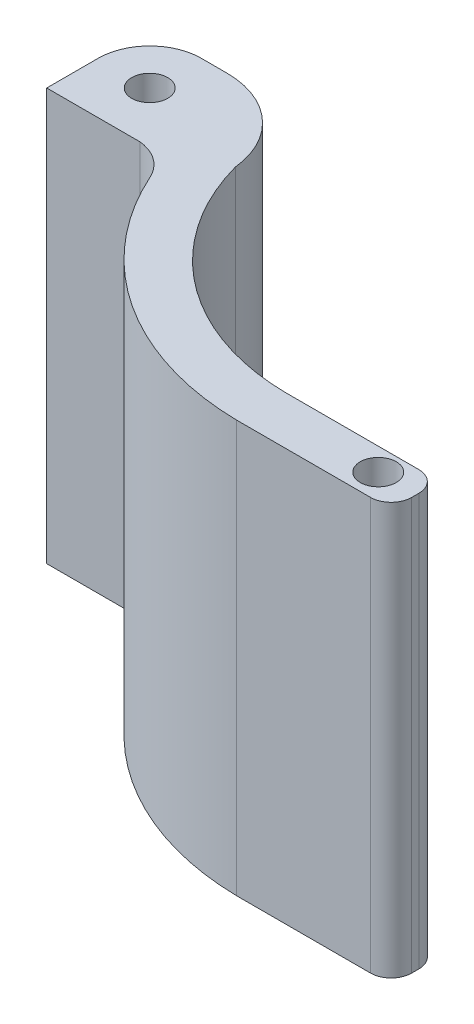
ISO-10303-21;
HEADER;
FILE_DESCRIPTION(('STEP AP214'),'2;1');
FILE_NAME('part.step','',(''),(''),'','','');
FILE_SCHEMA(('AUTOMOTIVE_DESIGN { 1 0 10303 214 1 1 1 1 }'));
ENDSEC;
DATA;
#1=APPLICATION_CONTEXT('core data for automotive mechanical design processes');
#2=APPLICATION_PROTOCOL_DEFINITION('international standard','automotive_design',2000,#1);
#3=PRODUCT_CONTEXT('',#1,'mechanical');
#4=PRODUCT('Part','Part','',(#3));
#5=PRODUCT_RELATED_PRODUCT_CATEGORY('part','',(#4));
#6=PRODUCT_DEFINITION_FORMATION('','',#4);
#7=PRODUCT_DEFINITION_CONTEXT('part definition',#1,'design');
#8=PRODUCT_DEFINITION('design','',#6,#7);
#9=PRODUCT_DEFINITION_SHAPE('','',#8);
#10=(LENGTH_UNIT() NAMED_UNIT(*) SI_UNIT(.MILLI.,.METRE.));
#11=(NAMED_UNIT(*) PLANE_ANGLE_UNIT() SI_UNIT($,.RADIAN.));
#12=(NAMED_UNIT(*) SI_UNIT($,.STERADIAN.) SOLID_ANGLE_UNIT());
#13=UNCERTAINTY_MEASURE_WITH_UNIT(LENGTH_MEASURE(1.E-05),#10,'distance_accuracy_value','');
#14=(GEOMETRIC_REPRESENTATION_CONTEXT(3) GLOBAL_UNCERTAINTY_ASSIGNED_CONTEXT((#13)) GLOBAL_UNIT_ASSIGNED_CONTEXT((#10,
#11,#12)) REPRESENTATION_CONTEXT('',''));
#15=CARTESIAN_POINT('',(0.,0.,0.));
#16=DIRECTION('',(0.,0.,1.));
#17=DIRECTION('',(1.,0.,0.));
#18=AXIS2_PLACEMENT_3D('',#15,#16,#17);
#19=CARTESIAN_POINT('',(-94.3917954966248,40.,-29.5011380138342));
#20=DIRECTION('',(0.,-1.,0.));
#21=DIRECTION('',(0.,0.,-1.));
#22=AXIS2_PLACEMENT_3D('',#19,#20,#21);
#23=PLANE('',#22);
#24=CARTESIAN_POINT('',(-94.3917954966248,40.,-29.5011380138342));
#25=DIRECTION('',(0.,1.,0.));
#26=DIRECTION('',(0.,0.,-1.));
#27=AXIS2_PLACEMENT_3D('',#24,#25,#26);
#28=CIRCLE('',#27,8.3508565841173);
#29=CARTESIAN_POINT('',(-86.0843982651353,40.,-30.3519945979515));
#30=VERTEX_POINT('',#29);
#31=CARTESIAN_POINT('',(-94.3917954966248,40.,-37.8519945979515));
#32=VERTEX_POINT('',#31);
#33=EDGE_CURVE('E185',#30,#32,#28,.T.);
#34=ORIENTED_EDGE('',*,*,#33,.T.);
#35=DIRECTION('',(-1.,0.,0.));
#36=VECTOR('',#35,1.);
#37=CARTESIAN_POINT('',(-96.8917954966248,40.,-37.8519945979515));
#38=LINE('',#37,#36);
#39=CARTESIAN_POINT('',(-96.8917954966248,40.,-37.8519945979515));
#40=VERTEX_POINT('',#39);
#41=EDGE_CURVE('E108',#32,#40,#38,.T.);
#42=ORIENTED_EDGE('',*,*,#41,.T.);
#43=CARTESIAN_POINT('',(-96.8917954966248,40.,-32.8519945979515));
#44=DIRECTION('',(0.,1.,0.));
#45=DIRECTION('',(0.,0.,-1.));
#46=AXIS2_PLACEMENT_3D('',#43,#44,#45);
#47=CIRCLE('',#46,4.99999999999999);
#48=CARTESIAN_POINT('',(-101.891795496625,40.,-32.8519945979515));
#49=VERTEX_POINT('',#48);
#50=EDGE_CURVE('E215',#40,#49,#47,.T.);
#51=ORIENTED_EDGE('',*,*,#50,.T.);
#52=DIRECTION('',(0.,0.,1.));
#53=VECTOR('',#52,1.);
#54=CARTESIAN_POINT('',(-101.891795496625,40.,-32.8519945979515));
#55=LINE('',#54,#53);
#56=CARTESIAN_POINT('',(-101.891795496625,40.,-27.8519945979515));
#57=VERTEX_POINT('',#56);
#58=EDGE_CURVE('E234',#49,#57,#55,.T.);
#59=ORIENTED_EDGE('',*,*,#58,.T.);
#60=DIRECTION('',(1.,0.,0.));
#61=VECTOR('',#60,1.);
#62=CARTESIAN_POINT('',(-92.8473054087636,40.,-27.8519945979515));
#63=LINE('',#62,#61);
#64=CARTESIAN_POINT('',(-92.8473054087636,40.,-27.8519945979515));
#65=VERTEX_POINT('',#64);
#66=EDGE_CURVE('E231',#57,#65,#63,.T.);
#67=ORIENTED_EDGE('',*,*,#66,.T.);
#68=CARTESIAN_POINT('',(-93.264374858203,40.,-23.5966883254714));
#69=DIRECTION('',(0.,-1.,0.));
#70=DIRECTION('',(0.,0.,1.));
#71=AXIS2_PLACEMENT_3D('',#68,#69,#70);
#72=CIRCLE('',#71,4.27569624719349);
#73=CARTESIAN_POINT('',(-89.3655957816127,40.,-25.3519945979515));
#74=VERTEX_POINT('',#73);
#75=EDGE_CURVE('E233',#65,#74,#72,.T.);
#76=ORIENTED_EDGE('',*,*,#75,.T.);
#77=CARTESIAN_POINT('',(-64.2898143397932,40.,-36.6415997762619));
#78=DIRECTION('',(0.,1.,0.));
#79=DIRECTION('',(0.,0.,1.));
#80=AXIS2_PLACEMENT_3D('',#77,#78,#79);
#81=CIRCLE('',#80,27.5000000000006);
#82=CARTESIAN_POINT('',(-64.7447597290198,40.,-9.14536322118333));
#83=VERTEX_POINT('',#82);
#84=EDGE_CURVE('E236',#74,#83,#81,.T.);
#85=ORIENTED_EDGE('',*,*,#84,.T.);
#86=DIRECTION('',(1.,0.,0.));
#87=VECTOR('',#86,1.);
#88=CARTESIAN_POINT('',(-64.7447597290198,40.,-9.14536322118333));
#89=LINE('',#88,#87);
#90=CARTESIAN_POINT('',(-51.7447597290198,40.,-9.14536322118287));
#91=VERTEX_POINT('',#90);
#92=EDGE_CURVE('E242',#83,#91,#89,.T.);
#93=ORIENTED_EDGE('',*,*,#92,.T.);
#94=CARTESIAN_POINT('',(-51.7447597290198,40.,-11.1453632211829));
#95=DIRECTION('',(0.,1.,0.));
#96=DIRECTION('',(0.,0.,-1.));
#97=AXIS2_PLACEMENT_3D('',#94,#95,#96);
#98=CIRCLE('',#97,2.);
#99=CARTESIAN_POINT('',(-49.7447597290198,40.,-11.1453632211829));
#100=VERTEX_POINT('',#99);
#101=EDGE_CURVE('E244',#91,#100,#98,.T.);
#102=ORIENTED_EDGE('',*,*,#101,.T.);
#103=DIRECTION('',(0.,0.,-1.));
#104=VECTOR('',#103,1.);
#105=CARTESIAN_POINT('',(-49.7447597290198,40.,-11.8316446574437));
#106=LINE('',#105,#104);
#107=CARTESIAN_POINT('',(-49.7447597290198,40.,-11.8316446574437));
#108=VERTEX_POINT('',#107);
#109=EDGE_CURVE('E142',#100,#108,#106,.T.);
#110=ORIENTED_EDGE('',*,*,#109,.T.);
#111=CARTESIAN_POINT('',(-51.7447597290198,40.,-11.8316446574437));
#112=DIRECTION('',(0.,1.,0.));
#113=DIRECTION('',(0.,0.,1.));
#114=AXIS2_PLACEMENT_3D('',#111,#112,#113);
#115=CIRCLE('',#114,2.);
#116=CARTESIAN_POINT('',(-51.7447597290198,40.,-13.8316446574437));
#117=VERTEX_POINT('',#116);
#118=EDGE_CURVE('E136',#108,#117,#115,.T.);
#119=ORIENTED_EDGE('',*,*,#118,.T.);
#120=DIRECTION('',(-1.,0.,0.));
#121=VECTOR('',#120,1.);
#122=CARTESIAN_POINT('',(-64.7460429177072,40.,-13.8316446574437));
#123=LINE('',#122,#121);
#124=CARTESIAN_POINT('',(-64.7460429177072,40.,-13.8316446574437));
#125=VERTEX_POINT('',#124);
#126=EDGE_CURVE('E140',#117,#125,#123,.T.);
#127=ORIENTED_EDGE('',*,*,#126,.T.);
#128=CARTESIAN_POINT('',(-64.3927651310505,40.,-36.3288710377213));
#129=DIRECTION('',(0.,-1.,0.));
#130=DIRECTION('',(0.,0.,1.));
#131=AXIS2_PLACEMENT_3D('',#128,#129,#130);
#132=CIRCLE('',#131,22.5);
#133=EDGE_CURVE('E50',#125,#30,#132,.T.);
#134=ORIENTED_EDGE('',*,*,#133,.T.);
#135=EDGE_LOOP('',(#34,#42,#51,#59,#67,#76,#85,#93,#102,#110,#119,#127,#134));
#136=FACE_BOUND('',#135,.T.);
#137=CARTESIAN_POINT('',(-96.8917954966248,40.,-32.8519945979515));
#138=DIRECTION('',(0.,1.,0.));
#139=DIRECTION('',(0.,0.,1.));
#140=AXIS2_PLACEMENT_3D('',#137,#138,#139);
#141=CIRCLE('',#140,1.75);
#142=CARTESIAN_POINT('',(-96.8917954966248,40.,-31.1019945979515));
#143=VERTEX_POINT('',#142);
#144=EDGE_CURVE('E164',#143,#143,#141,.T.);
#145=ORIENTED_EDGE('',*,*,#144,.F.);
#146=EDGE_LOOP('',(#145));
#147=FACE_BOUND('',#146,.T.);
#148=CARTESIAN_POINT('',(-53.4947597290198,40.,-11.6453632211829));
#149=DIRECTION('',(0.,1.,0.));
#150=DIRECTION('',(0.,0.,1.));
#151=AXIS2_PLACEMENT_3D('',#148,#149,#150);
#152=CIRCLE('',#151,1.75000000001735);
#153=CARTESIAN_POINT('',(-53.4947597290198,40.,-9.89536322116553));
#154=VERTEX_POINT('',#153);
#155=EDGE_CURVE('E285',#154,#154,#152,.T.);
#156=ORIENTED_EDGE('',*,*,#155,.F.);
#157=EDGE_LOOP('',(#156));
#158=FACE_BOUND('',#157,.T.);
#159=ADVANCED_FACE('F33',(#136,#147,#158),#23,.F.);
#160=CARTESIAN_POINT('',(-94.3917954966248,0.,-29.5011380138342));
#161=DIRECTION('',(0.,-1.,0.));
#162=DIRECTION('',(0.,0.,-1.));
#163=AXIS2_PLACEMENT_3D('',#160,#161,#162);
#164=PLANE('',#163);
#165=CARTESIAN_POINT('',(-96.8917954966248,0.,-32.8519945979515));
#166=DIRECTION('',(0.,1.,0.));
#167=DIRECTION('',(0.,0.,1.));
#168=AXIS2_PLACEMENT_3D('',#165,#166,#167);
#169=CIRCLE('',#168,1.75);
#170=CARTESIAN_POINT('',(-96.8917954966248,0.,-31.1019945979515));
#171=VERTEX_POINT('',#170);
#172=EDGE_CURVE('E290',#171,#171,#169,.T.);
#173=ORIENTED_EDGE('',*,*,#172,.T.);
#174=EDGE_LOOP('',(#173));
#175=FACE_BOUND('',#174,.T.);
#176=CARTESIAN_POINT('',(-94.3917954966248,0.,-29.5011380138342));
#177=DIRECTION('',(0.,1.,0.));
#178=DIRECTION('',(0.,0.,-1.));
#179=AXIS2_PLACEMENT_3D('',#176,#177,#178);
#180=CIRCLE('',#179,8.3508565841173);
#181=CARTESIAN_POINT('',(-86.0843982651353,0.,-30.3519945979515));
#182=VERTEX_POINT('',#181);
#183=CARTESIAN_POINT('',(-94.3917954966248,0.,-37.8519945979515));
#184=VERTEX_POINT('',#183);
#185=EDGE_CURVE('E160',#182,#184,#180,.T.);
#186=ORIENTED_EDGE('',*,*,#185,.F.);
#187=CARTESIAN_POINT('',(-64.3927651310505,0.,-36.3288710377213));
#188=DIRECTION('',(0.,-1.,0.));
#189=DIRECTION('',(0.,0.,1.));
#190=AXIS2_PLACEMENT_3D('',#187,#188,#189);
#191=CIRCLE('',#190,22.5);
#192=CARTESIAN_POINT('',(-64.7460429177072,0.,-13.8316446574437));
#193=VERTEX_POINT('',#192);
#194=EDGE_CURVE('E100',#193,#182,#191,.T.);
#195=ORIENTED_EDGE('',*,*,#194,.F.);
#196=DIRECTION('',(-1.,0.,0.));
#197=VECTOR('',#196,1.);
#198=CARTESIAN_POINT('',(-64.7460429177072,0.,-13.8316446574437));
#199=LINE('',#198,#197);
#200=CARTESIAN_POINT('',(-51.7447597290198,0.,-13.8316446574437));
#201=VERTEX_POINT('',#200);
#202=EDGE_CURVE('E94',#201,#193,#199,.T.);
#203=ORIENTED_EDGE('',*,*,#202,.F.);
#204=CARTESIAN_POINT('',(-51.7447597290198,0.,-11.8316446574437));
#205=DIRECTION('',(0.,1.,0.));
#206=DIRECTION('',(0.,0.,1.));
#207=AXIS2_PLACEMENT_3D('',#204,#205,#206);
#208=CIRCLE('',#207,2.);
#209=CARTESIAN_POINT('',(-49.7447597290198,0.,-11.8316446574437));
#210=VERTEX_POINT('',#209);
#211=EDGE_CURVE('E150',#210,#201,#208,.T.);
#212=ORIENTED_EDGE('',*,*,#211,.F.);
#213=DIRECTION('',(0.,0.,-1.));
#214=VECTOR('',#213,1.);
#215=CARTESIAN_POINT('',(-49.7447597290198,0.,-11.8316446574437));
#216=LINE('',#215,#214);
#217=CARTESIAN_POINT('',(-49.7447597290198,0.,-11.1453632211829));
#218=VERTEX_POINT('',#217);
#219=EDGE_CURVE('E180',#218,#210,#216,.T.);
#220=ORIENTED_EDGE('',*,*,#219,.F.);
#221=CARTESIAN_POINT('',(-51.7447597290198,0.,-11.1453632211829));
#222=DIRECTION('',(0.,1.,0.));
#223=DIRECTION('',(0.,0.,-1.));
#224=AXIS2_PLACEMENT_3D('',#221,#222,#223);
#225=CIRCLE('',#224,2.);
#226=CARTESIAN_POINT('',(-51.7447597290198,0.,-9.14536322118287));
#227=VERTEX_POINT('',#226);
#228=EDGE_CURVE('E178',#227,#218,#225,.T.);
#229=ORIENTED_EDGE('',*,*,#228,.F.);
#230=DIRECTION('',(1.,0.,0.));
#231=VECTOR('',#230,1.);
#232=CARTESIAN_POINT('',(-64.7447597290198,0.,-9.14536322118333));
#233=LINE('',#232,#231);
#234=CARTESIAN_POINT('',(-64.7447597290198,0.,-9.14536322118333));
#235=VERTEX_POINT('',#234);
#236=EDGE_CURVE('E176',#235,#227,#233,.T.);
#237=ORIENTED_EDGE('',*,*,#236,.F.);
#238=CARTESIAN_POINT('',(-64.2898143397932,0.,-36.6415997762619));
#239=DIRECTION('',(0.,1.,0.));
#240=DIRECTION('',(0.,0.,1.));
#241=AXIS2_PLACEMENT_3D('',#238,#239,#240);
#242=CIRCLE('',#241,27.5000000000006);
#243=CARTESIAN_POINT('',(-89.3655957816127,0.,-25.3519945979515));
#244=VERTEX_POINT('',#243);
#245=EDGE_CURVE('E174',#244,#235,#242,.T.);
#246=ORIENTED_EDGE('',*,*,#245,.F.);
#247=CARTESIAN_POINT('',(-93.264374858203,0.,-23.5966883254714));
#248=DIRECTION('',(0.,-1.,0.));
#249=DIRECTION('',(0.,0.,1.));
#250=AXIS2_PLACEMENT_3D('',#247,#248,#249);
#251=CIRCLE('',#250,4.27569624719349);
#252=CARTESIAN_POINT('',(-92.8473054087636,0.,-27.8519945979515));
#253=VERTEX_POINT('',#252);
#254=EDGE_CURVE('E172',#253,#244,#251,.T.);
#255=ORIENTED_EDGE('',*,*,#254,.F.);
#256=DIRECTION('',(1.,0.,0.));
#257=VECTOR('',#256,1.);
#258=CARTESIAN_POINT('',(-92.8473054087636,0.,-27.8519945979515));
#259=LINE('',#258,#257);
#260=CARTESIAN_POINT('',(-101.891795496625,0.,-27.8519945979515));
#261=VERTEX_POINT('',#260);
#262=EDGE_CURVE('E170',#261,#253,#259,.T.);
#263=ORIENTED_EDGE('',*,*,#262,.F.);
#264=DIRECTION('',(0.,0.,1.));
#265=VECTOR('',#264,1.);
#266=CARTESIAN_POINT('',(-101.891795496625,0.,-32.8519945979515));
#267=LINE('',#266,#265);
#268=CARTESIAN_POINT('',(-101.891795496625,0.,-32.8519945979515));
#269=VERTEX_POINT('',#268);
#270=EDGE_CURVE('E168',#269,#261,#267,.T.);
#271=ORIENTED_EDGE('',*,*,#270,.F.);
#272=CARTESIAN_POINT('',(-96.8917954966248,0.,-32.8519945979515));
#273=DIRECTION('',(0.,1.,0.));
#274=DIRECTION('',(0.,0.,-1.));
#275=AXIS2_PLACEMENT_3D('',#272,#273,#274);
#276=CIRCLE('',#275,4.99999999999999);
#277=CARTESIAN_POINT('',(-96.8917954966248,0.,-37.8519945979515));
#278=VERTEX_POINT('',#277);
#279=EDGE_CURVE('E166',#278,#269,#276,.T.);
#280=ORIENTED_EDGE('',*,*,#279,.F.);
#281=DIRECTION('',(-1.,0.,0.));
#282=VECTOR('',#281,1.);
#283=CARTESIAN_POINT('',(-96.8917954966248,0.,-37.8519945979515));
#284=LINE('',#283,#282);
#285=EDGE_CURVE('E163',#184,#278,#284,.T.);
#286=ORIENTED_EDGE('',*,*,#285,.F.);
#287=EDGE_LOOP('',(#186,#195,#203,#212,#220,#229,#237,#246,#255,#263,#271,#280,#286));
#288=FACE_BOUND('',#287,.T.);
#289=CARTESIAN_POINT('',(-53.4947597290198,0.,-11.6453632211829));
#290=DIRECTION('',(0.,1.,0.));
#291=DIRECTION('',(0.,0.,1.));
#292=AXIS2_PLACEMENT_3D('',#289,#290,#291);
#293=CIRCLE('',#292,1.75000000001735);
#294=CARTESIAN_POINT('',(-53.4947597290198,0.,-9.89536322116553));
#295=VERTEX_POINT('',#294);
#296=EDGE_CURVE('E288',#295,#295,#293,.T.);
#297=ORIENTED_EDGE('',*,*,#296,.T.);
#298=EDGE_LOOP('',(#297));
#299=FACE_BOUND('',#298,.T.);
#300=ADVANCED_FACE('F219',(#175,#288,#299),#164,.T.);
#301=CARTESIAN_POINT('',(-94.3917954966248,40.,-29.5011380138342));
#302=DIRECTION('',(0.,-1.,0.));
#303=DIRECTION('',(0.,0.,-1.));
#304=AXIS2_PLACEMENT_3D('',#301,#302,#303);
#305=CYLINDRICAL_SURFACE('',#304,8.3508565841173);
#306=ORIENTED_EDGE('',*,*,#185,.T.);
#307=DIRECTION('',(0.,-1.,0.));
#308=VECTOR('',#307,1.);
#309=CARTESIAN_POINT('',(-94.3917954966248,40.,-37.8519945979515));
#310=LINE('',#309,#308);
#311=EDGE_CURVE('E11',#32,#184,#310,.T.);
#312=ORIENTED_EDGE('',*,*,#311,.F.);
#313=ORIENTED_EDGE('',*,*,#33,.F.);
#314=DIRECTION('',(0.,-1.,0.));
#315=VECTOR('',#314,1.);
#316=CARTESIAN_POINT('',(-86.0843982651353,40.,-30.3519945979515));
#317=LINE('',#316,#315);
#318=EDGE_CURVE('E156',#30,#182,#317,.T.);
#319=ORIENTED_EDGE('',*,*,#318,.T.);
#320=EDGE_LOOP('',(#306,#312,#313,#319));
#321=FACE_BOUND('',#320,.T.);
#322=ADVANCED_FACE('F35',(#321),#305,.T.);
#323=CARTESIAN_POINT('',(-96.8917954966248,40.,-37.8519945979515));
#324=DIRECTION('',(0.,0.,1.));
#325=DIRECTION('',(1.,0.,0.));
#326=AXIS2_PLACEMENT_3D('',#323,#324,#325);
#327=PLANE('',#326);
#328=ORIENTED_EDGE('',*,*,#285,.T.);
#329=DIRECTION('',(0.,-1.,0.));
#330=VECTOR('',#329,1.);
#331=CARTESIAN_POINT('',(-96.8917954966248,40.,-37.8519945979515));
#332=LINE('',#331,#330);
#333=EDGE_CURVE('E42',#40,#278,#332,.T.);
#334=ORIENTED_EDGE('',*,*,#333,.F.);
#335=ORIENTED_EDGE('',*,*,#41,.F.);
#336=ORIENTED_EDGE('',*,*,#311,.T.);
#337=EDGE_LOOP('',(#328,#334,#335,#336));
#338=FACE_BOUND('',#337,.T.);
#339=ADVANCED_FACE('F395',(#338),#327,.F.);
#340=CARTESIAN_POINT('',(-96.8917954966248,40.,-32.8519945979515));
#341=DIRECTION('',(0.,-1.,0.));
#342=DIRECTION('',(0.,0.,-1.));
#343=AXIS2_PLACEMENT_3D('',#340,#341,#342);
#344=CYLINDRICAL_SURFACE('',#343,4.99999999999999);
#345=ORIENTED_EDGE('',*,*,#279,.T.);
#346=DIRECTION('',(0.,-1.,0.));
#347=VECTOR('',#346,1.);
#348=CARTESIAN_POINT('',(-101.891795496625,40.,-32.8519945979515));
#349=LINE('',#348,#347);
#350=EDGE_CURVE('E207',#49,#269,#349,.T.);
#351=ORIENTED_EDGE('',*,*,#350,.F.);
#352=ORIENTED_EDGE('',*,*,#50,.F.);
#353=ORIENTED_EDGE('',*,*,#333,.T.);
#354=EDGE_LOOP('',(#345,#351,#352,#353));
#355=FACE_BOUND('',#354,.T.);
#356=ADVANCED_FACE('F213',(#355),#344,.T.);
#357=CARTESIAN_POINT('',(-101.891795496625,40.,-32.8519945979515));
#358=DIRECTION('',(1.,0.,0.));
#359=DIRECTION('',(0.,0.,-1.));
#360=AXIS2_PLACEMENT_3D('',#357,#358,#359);
#361=PLANE('',#360);
#362=ORIENTED_EDGE('',*,*,#270,.T.);
#363=DIRECTION('',(0.,-1.,0.));
#364=VECTOR('',#363,1.);
#365=CARTESIAN_POINT('',(-101.891795496625,40.,-27.8519945979515));
#366=LINE('',#365,#364);
#367=EDGE_CURVE('E204',#57,#261,#366,.T.);
#368=ORIENTED_EDGE('',*,*,#367,.F.);
#369=ORIENTED_EDGE('',*,*,#58,.F.);
#370=ORIENTED_EDGE('',*,*,#350,.T.);
#371=EDGE_LOOP('',(#362,#368,#369,#370));
#372=FACE_BOUND('',#371,.T.);
#373=ADVANCED_FACE('F225',(#372),#361,.F.);
#374=CARTESIAN_POINT('',(-92.8473054087636,40.,-27.8519945979515));
#375=DIRECTION('',(0.,0.,-1.));
#376=DIRECTION('',(-1.,0.,0.));
#377=AXIS2_PLACEMENT_3D('',#374,#375,#376);
#378=PLANE('',#377);
#379=ORIENTED_EDGE('',*,*,#262,.T.);
#380=DIRECTION('',(0.,-1.,0.));
#381=VECTOR('',#380,1.);
#382=CARTESIAN_POINT('',(-92.8473054087636,40.,-27.8519945979515));
#383=LINE('',#382,#381);
#384=EDGE_CURVE('E201',#65,#253,#383,.T.);
#385=ORIENTED_EDGE('',*,*,#384,.F.);
#386=ORIENTED_EDGE('',*,*,#66,.F.);
#387=ORIENTED_EDGE('',*,*,#367,.T.);
#388=EDGE_LOOP('',(#379,#385,#386,#387));
#389=FACE_BOUND('',#388,.T.);
#390=ADVANCED_FACE('F229',(#389),#378,.F.);
#391=CARTESIAN_POINT('',(-93.264374858203,40.,-23.5966883254714));
#392=DIRECTION('',(0.,-1.,0.));
#393=DIRECTION('',(0.,0.,-1.));
#394=AXIS2_PLACEMENT_3D('',#391,#392,#393);
#395=CYLINDRICAL_SURFACE('',#394,4.27569624719349);
#396=ORIENTED_EDGE('',*,*,#254,.T.);
#397=DIRECTION('',(0.,-1.,0.));
#398=VECTOR('',#397,1.);
#399=CARTESIAN_POINT('',(-89.3655957816127,40.,-25.3519945979515));
#400=LINE('',#399,#398);
#401=EDGE_CURVE('E198',#74,#244,#400,.T.);
#402=ORIENTED_EDGE('',*,*,#401,.F.);
#403=ORIENTED_EDGE('',*,*,#75,.F.);
#404=ORIENTED_EDGE('',*,*,#384,.T.);
#405=EDGE_LOOP('',(#396,#402,#403,#404));
#406=FACE_BOUND('',#405,.T.);
#407=ADVANCED_FACE('F360',(#406),#395,.F.);
#408=CARTESIAN_POINT('',(-64.2898143397932,40.,-36.6415997762619));
#409=DIRECTION('',(0.,-1.,0.));
#410=DIRECTION('',(0.,0.,-1.));
#411=AXIS2_PLACEMENT_3D('',#408,#409,#410);
#412=CYLINDRICAL_SURFACE('',#411,27.5000000000006);
#413=ORIENTED_EDGE('',*,*,#245,.T.);
#414=DIRECTION('',(0.,-1.,0.));
#415=VECTOR('',#414,1.);
#416=CARTESIAN_POINT('',(-64.7447597290198,40.,-9.14536322118333));
#417=LINE('',#416,#415);
#418=EDGE_CURVE('E195',#83,#235,#417,.T.);
#419=ORIENTED_EDGE('',*,*,#418,.F.);
#420=ORIENTED_EDGE('',*,*,#84,.F.);
#421=ORIENTED_EDGE('',*,*,#401,.T.);
#422=EDGE_LOOP('',(#413,#419,#420,#421));
#423=FACE_BOUND('',#422,.T.);
#424=ADVANCED_FACE('F350',(#423),#412,.T.);
#425=CARTESIAN_POINT('',(-64.7447597290198,40.,-9.14536322118333));
#426=DIRECTION('',(0.,0.,-1.));
#427=DIRECTION('',(-1.,0.,0.));
#428=AXIS2_PLACEMENT_3D('',#425,#426,#427);
#429=PLANE('',#428);
#430=ORIENTED_EDGE('',*,*,#236,.T.);
#431=DIRECTION('',(0.,-1.,0.));
#432=VECTOR('',#431,1.);
#433=CARTESIAN_POINT('',(-51.7447597290198,40.,-9.14536322118287));
#434=LINE('',#433,#432);
#435=EDGE_CURVE('E192',#91,#227,#434,.T.);
#436=ORIENTED_EDGE('',*,*,#435,.F.);
#437=ORIENTED_EDGE('',*,*,#92,.F.);
#438=ORIENTED_EDGE('',*,*,#418,.T.);
#439=EDGE_LOOP('',(#430,#436,#437,#438));
#440=FACE_BOUND('',#439,.T.);
#441=ADVANCED_FACE('F341',(#440),#429,.F.);
#442=CARTESIAN_POINT('',(-51.7447597290198,40.,-11.1453632211829));
#443=DIRECTION('',(0.,-1.,0.));
#444=DIRECTION('',(0.,0.,-1.));
#445=AXIS2_PLACEMENT_3D('',#442,#443,#444);
#446=CYLINDRICAL_SURFACE('',#445,2.);
#447=ORIENTED_EDGE('',*,*,#228,.T.);
#448=DIRECTION('',(0.,-1.,0.));
#449=VECTOR('',#448,1.);
#450=CARTESIAN_POINT('',(-49.7447597290198,40.,-11.1453632211829));
#451=LINE('',#450,#449);
#452=EDGE_CURVE('E189',#100,#218,#451,.T.);
#453=ORIENTED_EDGE('',*,*,#452,.F.);
#454=ORIENTED_EDGE('',*,*,#101,.F.);
#455=ORIENTED_EDGE('',*,*,#435,.T.);
#456=EDGE_LOOP('',(#447,#453,#454,#455));
#457=FACE_BOUND('',#456,.T.);
#458=ADVANCED_FACE('F250',(#457),#446,.T.);
#459=CARTESIAN_POINT('',(-49.7447597290198,40.,-11.8316446574437));
#460=DIRECTION('',(-1.,0.,0.));
#461=DIRECTION('',(0.,0.,1.));
#462=AXIS2_PLACEMENT_3D('',#459,#460,#461);
#463=PLANE('',#462);
#464=ORIENTED_EDGE('',*,*,#219,.T.);
#465=DIRECTION('',(0.,-1.,0.));
#466=VECTOR('',#465,1.);
#467=CARTESIAN_POINT('',(-49.7447597290198,40.,-11.8316446574437));
#468=LINE('',#467,#466);
#469=EDGE_CURVE('E151',#108,#210,#468,.T.);
#470=ORIENTED_EDGE('',*,*,#469,.F.);
#471=ORIENTED_EDGE('',*,*,#109,.F.);
#472=ORIENTED_EDGE('',*,*,#452,.T.);
#473=EDGE_LOOP('',(#464,#470,#471,#472));
#474=FACE_BOUND('',#473,.T.);
#475=ADVANCED_FACE('F254',(#474),#463,.F.);
#476=CARTESIAN_POINT('',(-51.7447597290198,40.,-11.8316446574437));
#477=DIRECTION('',(0.,-1.,0.));
#478=DIRECTION('',(0.,0.,-1.));
#479=AXIS2_PLACEMENT_3D('',#476,#477,#478);
#480=CYLINDRICAL_SURFACE('',#479,2.);
#481=ORIENTED_EDGE('',*,*,#211,.T.);
#482=DIRECTION('',(0.,-1.,0.));
#483=VECTOR('',#482,1.);
#484=CARTESIAN_POINT('',(-51.7447597290198,40.,-13.8316446574437));
#485=LINE('',#484,#483);
#486=EDGE_CURVE('E147',#117,#201,#485,.T.);
#487=ORIENTED_EDGE('',*,*,#486,.F.);
#488=ORIENTED_EDGE('',*,*,#118,.F.);
#489=ORIENTED_EDGE('',*,*,#469,.T.);
#490=EDGE_LOOP('',(#481,#487,#488,#489));
#491=FACE_BOUND('',#490,.T.);
#492=ADVANCED_FACE('F148',(#491),#480,.T.);
#493=CARTESIAN_POINT('',(-64.7460429177072,40.,-13.8316446574437));
#494=DIRECTION('',(0.,0.,1.));
#495=DIRECTION('',(1.,0.,0.));
#496=AXIS2_PLACEMENT_3D('',#493,#494,#495);
#497=PLANE('',#496);
#498=ORIENTED_EDGE('',*,*,#202,.T.);
#499=DIRECTION('',(0.,-1.,0.));
#500=VECTOR('',#499,1.);
#501=CARTESIAN_POINT('',(-64.7460429177072,40.,-13.8316446574437));
#502=LINE('',#501,#500);
#503=EDGE_CURVE('E152',#125,#193,#502,.T.);
#504=ORIENTED_EDGE('',*,*,#503,.F.);
#505=ORIENTED_EDGE('',*,*,#126,.F.);
#506=ORIENTED_EDGE('',*,*,#486,.T.);
#507=EDGE_LOOP('',(#498,#504,#505,#506));
#508=FACE_BOUND('',#507,.T.);
#509=ADVANCED_FACE('F154',(#508),#497,.F.);
#510=CARTESIAN_POINT('',(-64.3927651310505,40.,-36.3288710377213));
#511=DIRECTION('',(0.,-1.,0.));
#512=DIRECTION('',(0.,0.,-1.));
#513=AXIS2_PLACEMENT_3D('',#510,#511,#512);
#514=CYLINDRICAL_SURFACE('',#513,22.5);
#515=ORIENTED_EDGE('',*,*,#194,.T.);
#516=ORIENTED_EDGE('',*,*,#318,.F.);
#517=ORIENTED_EDGE('',*,*,#133,.F.);
#518=ORIENTED_EDGE('',*,*,#503,.T.);
#519=EDGE_LOOP('',(#515,#516,#517,#518));
#520=FACE_BOUND('',#519,.T.);
#521=ADVANCED_FACE('F258',(#520),#514,.F.);
#522=CARTESIAN_POINT('',(-96.8917954966248,40.,-32.8519945979515));
#523=DIRECTION('',(0.,-1.,0.));
#524=DIRECTION('',(0.,0.,-1.));
#525=AXIS2_PLACEMENT_3D('',#522,#523,#524);
#526=CYLINDRICAL_SURFACE('',#525,1.75);
#527=ORIENTED_EDGE('',*,*,#144,.T.);
#528=EDGE_LOOP('',(#527));
#529=FACE_BOUND('',#528,.T.);
#530=ORIENTED_EDGE('',*,*,#172,.F.);
#531=EDGE_LOOP('',(#530));
#532=FACE_BOUND('',#531,.T.);
#533=ADVANCED_FACE('F260',(#529,#532),#526,.F.);
#534=CARTESIAN_POINT('',(-53.4947597290198,40.,-11.6453632211829));
#535=DIRECTION('',(0.,-1.,0.));
#536=DIRECTION('',(0.,0.,-1.));
#537=AXIS2_PLACEMENT_3D('',#534,#535,#536);
#538=CYLINDRICAL_SURFACE('',#537,1.75000000001735);
#539=ORIENTED_EDGE('',*,*,#155,.T.);
#540=EDGE_LOOP('',(#539));
#541=FACE_BOUND('',#540,.T.);
#542=ORIENTED_EDGE('',*,*,#296,.F.);
#543=EDGE_LOOP('',(#542));
#544=FACE_BOUND('',#543,.T.);
#545=ADVANCED_FACE('F266',(#541,#544),#538,.F.);
#546=CLOSED_SHELL('',(#159,#300,#322,#339,#356,#373,#390,#407,#424,#441,#458,#475,#492,#509,
#521,#533,#545));
#547=MANIFOLD_SOLID_BREP('B2',#546);
#548=ADVANCED_BREP_SHAPE_REPRESENTATION('',(#18,#547),#14);
#549=SHAPE_DEFINITION_REPRESENTATION(#9,#548);
ENDSEC;
END-ISO-10303-21;
